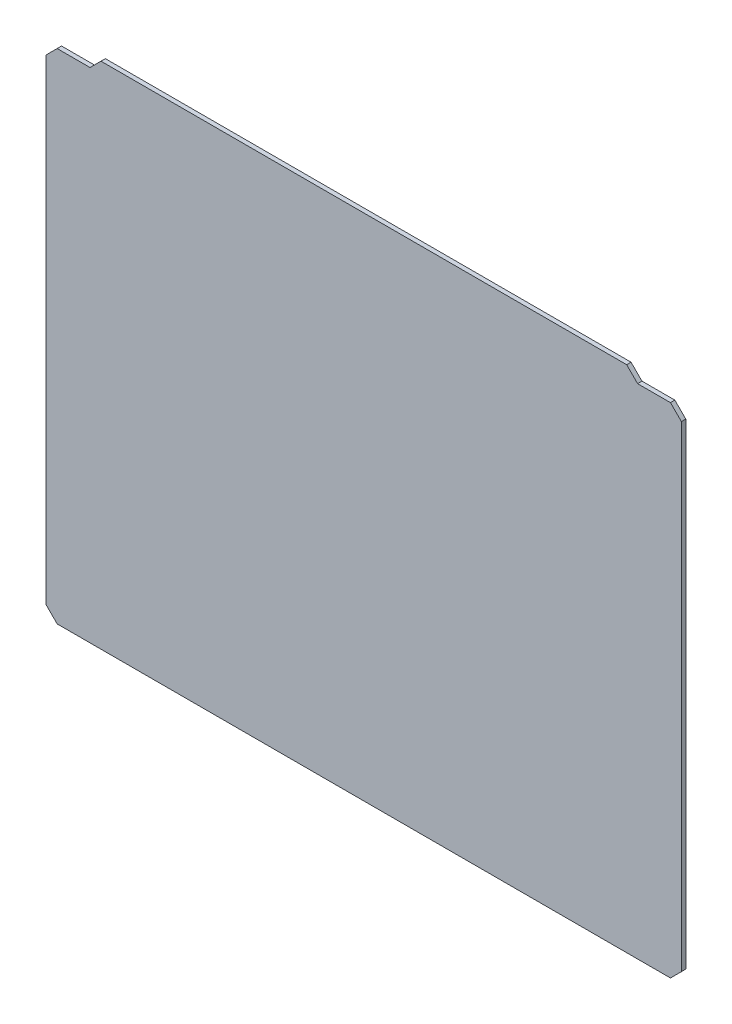
ISO-10303-21;
HEADER;
FILE_DESCRIPTION(('STEP AP214'),'2;1');
FILE_NAME('part.step','',(''),(''),'','','');
FILE_SCHEMA(('AUTOMOTIVE_DESIGN { 1 0 10303 214 1 1 1 1 }'));
ENDSEC;
DATA;
#1=APPLICATION_CONTEXT('core data for automotive mechanical design processes');
#2=APPLICATION_PROTOCOL_DEFINITION('international standard','automotive_design',2000,#1);
#3=PRODUCT_CONTEXT('',#1,'mechanical');
#4=PRODUCT('Part','Part','',(#3));
#5=PRODUCT_RELATED_PRODUCT_CATEGORY('part','',(#4));
#6=PRODUCT_DEFINITION_FORMATION('','',#4);
#7=PRODUCT_DEFINITION_CONTEXT('part definition',#1,'design');
#8=PRODUCT_DEFINITION('design','',#6,#7);
#9=PRODUCT_DEFINITION_SHAPE('','',#8);
#10=(LENGTH_UNIT() NAMED_UNIT(*) SI_UNIT(.MILLI.,.METRE.));
#11=(NAMED_UNIT(*) PLANE_ANGLE_UNIT() SI_UNIT($,.RADIAN.));
#12=(NAMED_UNIT(*) SI_UNIT($,.STERADIAN.) SOLID_ANGLE_UNIT());
#13=UNCERTAINTY_MEASURE_WITH_UNIT(LENGTH_MEASURE(1.E-05),#10,'distance_accuracy_value','');
#14=(GEOMETRIC_REPRESENTATION_CONTEXT(3) GLOBAL_UNCERTAINTY_ASSIGNED_CONTEXT((#13)) GLOBAL_UNIT_ASSIGNED_CONTEXT((#10,
#11,#12)) REPRESENTATION_CONTEXT('',''));
#15=CARTESIAN_POINT('',(0.,0.,0.));
#16=DIRECTION('',(0.,0.,1.));
#17=DIRECTION('',(1.,0.,0.));
#18=AXIS2_PLACEMENT_3D('',#15,#16,#17);
#19=CARTESIAN_POINT('',(-41.,-4.99999999999989,4.));
#20=DIRECTION('',(0.,-1.,0.));
#21=DIRECTION('',(1.,0.,0.));
#22=AXIS2_PLACEMENT_3D('',#19,#20,#21);
#23=PLANE('',#22);
#24=DIRECTION('',(-1.,0.,0.));
#25=VECTOR('',#24,1.);
#26=CARTESIAN_POINT('',(-41.,-4.99999999999989,0.));
#27=LINE('',#26,#25);
#28=CARTESIAN_POINT('',(-1.00000000000001,-4.99999999999989,0.));
#29=VERTEX_POINT('',#28);
#30=CARTESIAN_POINT('',(-30.9999999999999,-4.99999999999989,0.));
#31=VERTEX_POINT('',#30);
#32=EDGE_CURVE('E215',#29,#31,#27,.T.);
#33=ORIENTED_EDGE('',*,*,#32,.T.);
#34=DIRECTION('',(0.,0.,1.));
#35=VECTOR('',#34,1.);
#36=CARTESIAN_POINT('',(-30.9999999999999,-4.99999999999989,4.));
#37=LINE('',#36,#35);
#38=CARTESIAN_POINT('',(-30.9999999999999,-4.99999999999989,4.));
#39=VERTEX_POINT('',#38);
#40=EDGE_CURVE('E142',#31,#39,#37,.T.);
#41=ORIENTED_EDGE('',*,*,#40,.T.);
#42=DIRECTION('',(-1.,0.,0.));
#43=VECTOR('',#42,1.);
#44=CARTESIAN_POINT('',(-41.,-4.99999999999989,4.));
#45=LINE('',#44,#43);
#46=CARTESIAN_POINT('',(-1.00000000000001,-4.99999999999989,4.));
#47=VERTEX_POINT('',#46);
#48=EDGE_CURVE('E127',#47,#39,#45,.T.);
#49=ORIENTED_EDGE('',*,*,#48,.F.);
#50=DIRECTION('',(0.,0.,-1.));
#51=VECTOR('',#50,1.);
#52=CARTESIAN_POINT('',(-1.00000000000001,-4.99999999999989,4.));
#53=LINE('',#52,#51);
#54=EDGE_CURVE('E140',#47,#29,#53,.T.);
#55=ORIENTED_EDGE('',*,*,#54,.T.);
#56=EDGE_LOOP('',(#33,#41,#49,#55));
#57=FACE_BOUND('',#56,.T.);
#58=ADVANCED_FACE('F33',(#57),#23,.F.);
#59=CARTESIAN_POINT('',(-41.,-420.,4.));
#60=DIRECTION('',(1.,0.,0.));
#61=DIRECTION('',(0.,0.,-1.));
#62=AXIS2_PLACEMENT_3D('',#59,#60,#61);
#63=PLANE('',#62);
#64=DIRECTION('',(0.,-1.,0.));
#65=VECTOR('',#64,1.);
#66=CARTESIAN_POINT('',(-41.,-420.,4.));
#67=LINE('',#66,#65);
#68=CARTESIAN_POINT('',(-41.,-15.,4.));
#69=VERTEX_POINT('',#68);
#70=CARTESIAN_POINT('',(-41.,-450.,4.));
#71=VERTEX_POINT('',#70);
#72=EDGE_CURVE('E143',#69,#71,#67,.T.);
#73=ORIENTED_EDGE('',*,*,#72,.F.);
#74=DIRECTION('',(0.,0.,-1.));
#75=VECTOR('',#74,1.);
#76=CARTESIAN_POINT('',(-41.,-15.,4.));
#77=LINE('',#76,#75);
#78=CARTESIAN_POINT('',(-41.,-15.,0.));
#79=VERTEX_POINT('',#78);
#80=EDGE_CURVE('E166',#69,#79,#77,.T.);
#81=ORIENTED_EDGE('',*,*,#80,.T.);
#82=DIRECTION('',(0.,-1.,0.));
#83=VECTOR('',#82,1.);
#84=CARTESIAN_POINT('',(-41.,-420.,0.));
#85=LINE('',#84,#83);
#86=CARTESIAN_POINT('',(-41.,-450.,0.));
#87=VERTEX_POINT('',#86);
#88=EDGE_CURVE('E207',#79,#87,#85,.T.);
#89=ORIENTED_EDGE('',*,*,#88,.T.);
#90=DIRECTION('',(0.,0.,1.));
#91=VECTOR('',#90,1.);
#92=CARTESIAN_POINT('',(-41.,-450.,4.));
#93=LINE('',#92,#91);
#94=EDGE_CURVE('E164',#87,#71,#93,.T.);
#95=ORIENTED_EDGE('',*,*,#94,.T.);
#96=EDGE_LOOP('',(#73,#81,#89,#95));
#97=FACE_BOUND('',#96,.T.);
#98=ADVANCED_FACE('F238',(#97),#63,.F.);
#99=CARTESIAN_POINT('',(497.,-460.,4.));
#100=DIRECTION('',(0.,1.,0.));
#101=DIRECTION('',(0.,0.,1.));
#102=AXIS2_PLACEMENT_3D('',#99,#100,#101);
#103=PLANE('',#102);
#104=DIRECTION('',(1.,0.,0.));
#105=VECTOR('',#104,1.);
#106=CARTESIAN_POINT('',(-41.,-460.,4.));
#107=LINE('',#106,#105);
#108=CARTESIAN_POINT('',(-30.9999999999998,-460.,4.));
#109=VERTEX_POINT('',#108);
#110=CARTESIAN_POINT('',(529.,-460.,4.));
#111=VERTEX_POINT('',#110);
#112=EDGE_CURVE('E223',#109,#111,#107,.T.);
#113=ORIENTED_EDGE('',*,*,#112,.F.);
#114=DIRECTION('',(0.,0.,-1.));
#115=VECTOR('',#114,1.);
#116=CARTESIAN_POINT('',(-30.9999999999998,-460.,4.));
#117=LINE('',#116,#115);
#118=CARTESIAN_POINT('',(-30.9999999999998,-460.,0.));
#119=VERTEX_POINT('',#118);
#120=EDGE_CURVE('E187',#109,#119,#117,.T.);
#121=ORIENTED_EDGE('',*,*,#120,.T.);
#122=DIRECTION('',(1.,0.,0.));
#123=VECTOR('',#122,1.);
#124=CARTESIAN_POINT('',(497.,-460.,0.));
#125=LINE('',#124,#123);
#126=CARTESIAN_POINT('',(529.,-460.,0.));
#127=VERTEX_POINT('',#126);
#128=EDGE_CURVE('E204',#119,#127,#125,.T.);
#129=ORIENTED_EDGE('',*,*,#128,.T.);
#130=DIRECTION('',(0.,0.,1.));
#131=VECTOR('',#130,1.);
#132=CARTESIAN_POINT('',(529.,-460.,4.));
#133=LINE('',#132,#131);
#134=EDGE_CURVE('E185',#127,#111,#133,.T.);
#135=ORIENTED_EDGE('',*,*,#134,.T.);
#136=EDGE_LOOP('',(#113,#121,#129,#135));
#137=FACE_BOUND('',#136,.T.);
#138=ADVANCED_FACE('F236',(#137),#103,.F.);
#139=CARTESIAN_POINT('',(539.,-4.99999999999989,4.));
#140=DIRECTION('',(-1.,0.,0.));
#141=DIRECTION('',(0.,0.,1.));
#142=AXIS2_PLACEMENT_3D('',#139,#140,#141);
#143=PLANE('',#142);
#144=DIRECTION('',(0.,1.,0.));
#145=VECTOR('',#144,1.);
#146=CARTESIAN_POINT('',(539.,-460.,4.));
#147=LINE('',#146,#145);
#148=CARTESIAN_POINT('',(539.,-450.,4.));
#149=VERTEX_POINT('',#148);
#150=CARTESIAN_POINT('',(539.,-14.9999999999999,4.));
#151=VERTEX_POINT('',#150);
#152=EDGE_CURVE('E195',#149,#151,#147,.T.);
#153=ORIENTED_EDGE('',*,*,#152,.F.);
#154=DIRECTION('',(0.,0.,-1.));
#155=VECTOR('',#154,1.);
#156=CARTESIAN_POINT('',(539.,-450.,4.));
#157=LINE('',#156,#155);
#158=CARTESIAN_POINT('',(539.,-450.,0.));
#159=VERTEX_POINT('',#158);
#160=EDGE_CURVE('E41',#149,#159,#157,.T.);
#161=ORIENTED_EDGE('',*,*,#160,.T.);
#162=DIRECTION('',(0.,1.,0.));
#163=VECTOR('',#162,1.);
#164=CARTESIAN_POINT('',(539.,-4.99999999999989,0.));
#165=LINE('',#164,#163);
#166=CARTESIAN_POINT('',(539.,-14.9999999999999,0.));
#167=VERTEX_POINT('',#166);
#168=EDGE_CURVE('E194',#159,#167,#165,.T.);
#169=ORIENTED_EDGE('',*,*,#168,.T.);
#170=DIRECTION('',(0.,0.,1.));
#171=VECTOR('',#170,1.);
#172=CARTESIAN_POINT('',(539.,-14.9999999999999,4.));
#173=LINE('',#172,#171);
#174=EDGE_CURVE('E48',#167,#151,#173,.T.);
#175=ORIENTED_EDGE('',*,*,#174,.T.);
#176=EDGE_LOOP('',(#153,#161,#169,#175));
#177=FACE_BOUND('',#176,.T.);
#178=ADVANCED_FACE('F193',(#177),#143,.F.);
#179=CARTESIAN_POINT('',(499.,-4.99999999999989,4.));
#180=DIRECTION('',(0.,-1.,0.));
#181=DIRECTION('',(1.,0.,0.));
#182=AXIS2_PLACEMENT_3D('',#179,#180,#181);
#183=PLANE('',#182);
#184=DIRECTION('',(-1.,0.,0.));
#185=VECTOR('',#184,1.);
#186=CARTESIAN_POINT('',(499.,-4.99999999999989,4.));
#187=LINE('',#186,#185);
#188=CARTESIAN_POINT('',(529.,-4.99999999999989,4.));
#189=VERTEX_POINT('',#188);
#190=CARTESIAN_POINT('',(499.,-4.99999999999989,4.));
#191=VERTEX_POINT('',#190);
#192=EDGE_CURVE('E220',#189,#191,#187,.T.);
#193=ORIENTED_EDGE('',*,*,#192,.F.);
#194=DIRECTION('',(0.,0.,-1.));
#195=VECTOR('',#194,1.);
#196=CARTESIAN_POINT('',(529.,-4.99999999999989,4.));
#197=LINE('',#196,#195);
#198=CARTESIAN_POINT('',(529.,-4.99999999999989,0.));
#199=VERTEX_POINT('',#198);
#200=EDGE_CURVE('E11',#189,#199,#197,.T.);
#201=ORIENTED_EDGE('',*,*,#200,.T.);
#202=DIRECTION('',(-1.,0.,0.));
#203=VECTOR('',#202,1.);
#204=CARTESIAN_POINT('',(499.,-4.99999999999989,0.));
#205=LINE('',#204,#203);
#206=CARTESIAN_POINT('',(499.,-4.99999999999989,0.));
#207=VERTEX_POINT('',#206);
#208=EDGE_CURVE('E203',#199,#207,#205,.T.);
#209=ORIENTED_EDGE('',*,*,#208,.T.);
#210=DIRECTION('',(0.,0.,-1.));
#211=VECTOR('',#210,1.);
#212=CARTESIAN_POINT('',(499.,-4.99999999999989,4.));
#213=LINE('',#212,#211);
#214=EDGE_CURVE('E150',#191,#207,#213,.T.);
#215=ORIENTED_EDGE('',*,*,#214,.F.);
#216=EDGE_LOOP('',(#193,#201,#209,#215));
#217=FACE_BOUND('',#216,.T.);
#218=ADVANCED_FACE('F271',(#217),#183,.F.);
#219=CARTESIAN_POINT('',(-1.00000000000001,5.00000000000011,4.));
#220=DIRECTION('',(0.,-1.,0.));
#221=DIRECTION('',(0.,0.,-1.));
#222=AXIS2_PLACEMENT_3D('',#219,#220,#221);
#223=PLANE('',#222);
#224=DIRECTION('',(-1.,0.,0.));
#225=VECTOR('',#224,1.);
#226=CARTESIAN_POINT('',(-1.00000000000001,5.00000000000011,4.));
#227=LINE('',#226,#225);
#228=CARTESIAN_POINT('',(489.,5.00000000000011,4.));
#229=VERTEX_POINT('',#228);
#230=CARTESIAN_POINT('',(9.00000000000011,5.00000000000011,4.));
#231=VERTEX_POINT('',#230);
#232=EDGE_CURVE('E130',#229,#231,#227,.T.);
#233=ORIENTED_EDGE('',*,*,#232,.F.);
#234=DIRECTION('',(0.,0.,-1.));
#235=VECTOR('',#234,1.);
#236=CARTESIAN_POINT('',(489.,5.00000000000011,4.));
#237=LINE('',#236,#235);
#238=CARTESIAN_POINT('',(489.,5.00000000000011,0.));
#239=VERTEX_POINT('',#238);
#240=EDGE_CURVE('E152',#229,#239,#237,.T.);
#241=ORIENTED_EDGE('',*,*,#240,.T.);
#242=DIRECTION('',(-1.,0.,0.));
#243=VECTOR('',#242,1.);
#244=CARTESIAN_POINT('',(-1.00000000000001,5.00000000000011,0.));
#245=LINE('',#244,#243);
#246=CARTESIAN_POINT('',(9.00000000000011,5.00000000000011,0.));
#247=VERTEX_POINT('',#246);
#248=EDGE_CURVE('E144',#239,#247,#245,.T.);
#249=ORIENTED_EDGE('',*,*,#248,.T.);
#250=DIRECTION('',(0.,0.,1.));
#251=VECTOR('',#250,1.);
#252=CARTESIAN_POINT('',(9.00000000000011,5.00000000000011,4.));
#253=LINE('',#252,#251);
#254=EDGE_CURVE('E149',#247,#231,#253,.T.);
#255=ORIENTED_EDGE('',*,*,#254,.T.);
#256=EDGE_LOOP('',(#233,#241,#249,#255));
#257=FACE_BOUND('',#256,.T.);
#258=ADVANCED_FACE('F213',(#257),#223,.F.);
#259=CARTESIAN_POINT('',(0.,0.,4.));
#260=DIRECTION('',(0.,0.,1.));
#261=DIRECTION('',(1.,0.,0.));
#262=AXIS2_PLACEMENT_3D('',#259,#260,#261);
#263=PLANE('',#262);
#264=ORIENTED_EDGE('',*,*,#48,.T.);
#265=DIRECTION('',(0.707106781186548,0.707106781186548,0.));
#266=VECTOR('',#265,1.);
#267=CARTESIAN_POINT('',(-13.,13.,4.));
#268=LINE('',#267,#266);
#269=EDGE_CURVE('E183',#39,#69,#268,.F.);
#270=ORIENTED_EDGE('',*,*,#269,.T.);
#271=ORIENTED_EDGE('',*,*,#72,.T.);
#272=DIRECTION('',(-0.707106781186547,0.707106781186549,0.));
#273=VECTOR('',#272,1.);
#274=CARTESIAN_POINT('',(-245.5,-245.499999999999,4.));
#275=LINE('',#274,#273);
#276=EDGE_CURVE('E181',#71,#109,#275,.F.);
#277=ORIENTED_EDGE('',*,*,#276,.T.);
#278=ORIENTED_EDGE('',*,*,#112,.T.);
#279=DIRECTION('',(-0.707106781186548,-0.707106781186548,0.));
#280=VECTOR('',#279,1.);
#281=CARTESIAN_POINT('',(494.5,-494.5,4.));
#282=LINE('',#281,#280);
#283=EDGE_CURVE('E55',#111,#149,#282,.F.);
#284=ORIENTED_EDGE('',*,*,#283,.T.);
#285=ORIENTED_EDGE('',*,*,#152,.T.);
#286=DIRECTION('',(0.707106781186544,-0.707106781186551,0.));
#287=VECTOR('',#286,1.);
#288=CARTESIAN_POINT('',(262.000000000003,262.,4.));
#289=LINE('',#288,#287);
#290=EDGE_CURVE('E178',#151,#189,#289,.F.);
#291=ORIENTED_EDGE('',*,*,#290,.T.);
#292=ORIENTED_EDGE('',*,*,#192,.T.);
#293=DIRECTION('',(0.707106781186544,-0.707106781186551,0.));
#294=VECTOR('',#293,1.);
#295=CARTESIAN_POINT('',(247.000000000003,247.,4.));
#296=LINE('',#295,#294);
#297=EDGE_CURVE('E134',#191,#229,#296,.F.);
#298=ORIENTED_EDGE('',*,*,#297,.T.);
#299=ORIENTED_EDGE('',*,*,#232,.T.);
#300=DIRECTION('',(0.707106781186548,0.707106781186548,0.));
#301=VECTOR('',#300,1.);
#302=CARTESIAN_POINT('',(2.,-2.,4.));
#303=LINE('',#302,#301);
#304=EDGE_CURVE('E124',#231,#47,#303,.F.);
#305=ORIENTED_EDGE('',*,*,#304,.T.);
#306=EDGE_LOOP('',(#264,#270,#271,#277,#278,#284,#285,#291,#292,#298,#299,#305));
#307=FACE_BOUND('',#306,.T.);
#308=ADVANCED_FACE('F126',(#307),#263,.T.);
#309=CARTESIAN_POINT('',(0.,0.,0.));
#310=DIRECTION('',(0.,0.,1.));
#311=DIRECTION('',(1.,0.,0.));
#312=AXIS2_PLACEMENT_3D('',#309,#310,#311);
#313=PLANE('',#312);
#314=ORIENTED_EDGE('',*,*,#88,.F.);
#315=DIRECTION('',(-0.707106781186548,-0.707106781186548,0.));
#316=VECTOR('',#315,1.);
#317=CARTESIAN_POINT('',(-41.,-15.,0.));
#318=LINE('',#317,#316);
#319=EDGE_CURVE('E175',#79,#31,#318,.F.);
#320=ORIENTED_EDGE('',*,*,#319,.T.);
#321=ORIENTED_EDGE('',*,*,#32,.F.);
#322=DIRECTION('',(-0.707106781186548,-0.707106781186548,0.));
#323=VECTOR('',#322,1.);
#324=CARTESIAN_POINT('',(-1.00000000000001,-5.00000000000001,0.));
#325=LINE('',#324,#323);
#326=EDGE_CURVE('E147',#29,#247,#325,.F.);
#327=ORIENTED_EDGE('',*,*,#326,.T.);
#328=ORIENTED_EDGE('',*,*,#248,.F.);
#329=DIRECTION('',(-0.707106781186544,0.707106781186551,0.));
#330=VECTOR('',#329,1.);
#331=CARTESIAN_POINT('',(489.,5.00000000000011,0.));
#332=LINE('',#331,#330);
#333=EDGE_CURVE('E135',#239,#207,#332,.F.);
#334=ORIENTED_EDGE('',*,*,#333,.T.);
#335=ORIENTED_EDGE('',*,*,#208,.F.);
#336=DIRECTION('',(-0.707106781186544,0.707106781186551,0.));
#337=VECTOR('',#336,1.);
#338=CARTESIAN_POINT('',(529.,-4.99999999999989,0.));
#339=LINE('',#338,#337);
#340=EDGE_CURVE('E169',#199,#167,#339,.F.);
#341=ORIENTED_EDGE('',*,*,#340,.T.);
#342=ORIENTED_EDGE('',*,*,#168,.F.);
#343=DIRECTION('',(0.707106781186548,0.707106781186548,0.));
#344=VECTOR('',#343,1.);
#345=CARTESIAN_POINT('',(539.,-450.,0.));
#346=LINE('',#345,#344);
#347=EDGE_CURVE('E171',#159,#127,#346,.F.);
#348=ORIENTED_EDGE('',*,*,#347,.T.);
#349=ORIENTED_EDGE('',*,*,#128,.F.);
#350=DIRECTION('',(0.707106781186547,-0.707106781186549,0.));
#351=VECTOR('',#350,1.);
#352=CARTESIAN_POINT('',(-30.9999999999998,-460.,0.));
#353=LINE('',#352,#351);
#354=EDGE_CURVE('E173',#119,#87,#353,.F.);
#355=ORIENTED_EDGE('',*,*,#354,.T.);
#356=EDGE_LOOP('',(#314,#320,#321,#327,#328,#334,#335,#341,#342,#348,#349,#355));
#357=FACE_BOUND('',#356,.T.);
#358=ADVANCED_FACE('F199',(#357),#313,.F.);
#359=CARTESIAN_POINT('',(489.,5.00000000000011,4.));
#360=DIRECTION('',(-0.707106781186551,-0.707106781186544,0.));
#361=DIRECTION('',(0.,0.,-1.));
#362=AXIS2_PLACEMENT_3D('',#359,#360,#361);
#363=PLANE('',#362);
#364=ORIENTED_EDGE('',*,*,#297,.F.);
#365=ORIENTED_EDGE('',*,*,#214,.T.);
#366=ORIENTED_EDGE('',*,*,#333,.F.);
#367=ORIENTED_EDGE('',*,*,#240,.F.);
#368=EDGE_LOOP('',(#364,#365,#366,#367));
#369=FACE_BOUND('',#368,.T.);
#370=ADVANCED_FACE('F249',(#369),#363,.F.);
#371=CARTESIAN_POINT('',(-1.00000000000001,-5.00000000000001,4.));
#372=DIRECTION('',(0.707106781186547,-0.707106781186547,0.));
#373=DIRECTION('',(0.,0.,-1.));
#374=AXIS2_PLACEMENT_3D('',#371,#372,#373);
#375=PLANE('',#374);
#376=ORIENTED_EDGE('',*,*,#304,.F.);
#377=ORIENTED_EDGE('',*,*,#254,.F.);
#378=ORIENTED_EDGE('',*,*,#326,.F.);
#379=ORIENTED_EDGE('',*,*,#54,.F.);
#380=EDGE_LOOP('',(#376,#377,#378,#379));
#381=FACE_BOUND('',#380,.T.);
#382=ADVANCED_FACE('F146',(#381),#375,.F.);
#383=CARTESIAN_POINT('',(-41.,-15.,4.));
#384=DIRECTION('',(0.707106781186547,-0.707106781186547,0.));
#385=DIRECTION('',(0.,0.,-1.));
#386=AXIS2_PLACEMENT_3D('',#383,#384,#385);
#387=PLANE('',#386);
#388=ORIENTED_EDGE('',*,*,#269,.F.);
#389=ORIENTED_EDGE('',*,*,#40,.F.);
#390=ORIENTED_EDGE('',*,*,#319,.F.);
#391=ORIENTED_EDGE('',*,*,#80,.F.);
#392=EDGE_LOOP('',(#388,#389,#390,#391));
#393=FACE_BOUND('',#392,.T.);
#394=ADVANCED_FACE('F240',(#393),#387,.F.);
#395=CARTESIAN_POINT('',(-30.9999999999998,-460.,4.));
#396=DIRECTION('',(0.707106781186549,0.707106781186547,0.));
#397=DIRECTION('',(0.,0.,-1.));
#398=AXIS2_PLACEMENT_3D('',#395,#396,#397);
#399=PLANE('',#398);
#400=ORIENTED_EDGE('',*,*,#276,.F.);
#401=ORIENTED_EDGE('',*,*,#94,.F.);
#402=ORIENTED_EDGE('',*,*,#354,.F.);
#403=ORIENTED_EDGE('',*,*,#120,.F.);
#404=EDGE_LOOP('',(#400,#401,#402,#403));
#405=FACE_BOUND('',#404,.T.);
#406=ADVANCED_FACE('F234',(#405),#399,.F.);
#407=CARTESIAN_POINT('',(539.,-450.,4.));
#408=DIRECTION('',(-0.707106781186547,0.707106781186547,0.));
#409=DIRECTION('',(0.,0.,-1.));
#410=AXIS2_PLACEMENT_3D('',#407,#408,#409);
#411=PLANE('',#410);
#412=ORIENTED_EDGE('',*,*,#283,.F.);
#413=ORIENTED_EDGE('',*,*,#134,.F.);
#414=ORIENTED_EDGE('',*,*,#347,.F.);
#415=ORIENTED_EDGE('',*,*,#160,.F.);
#416=EDGE_LOOP('',(#412,#413,#414,#415));
#417=FACE_BOUND('',#416,.T.);
#418=ADVANCED_FACE('F247',(#417),#411,.F.);
#419=CARTESIAN_POINT('',(529.,-4.99999999999989,4.));
#420=DIRECTION('',(-0.707106781186551,-0.707106781186544,0.));
#421=DIRECTION('',(0.,0.,-1.));
#422=AXIS2_PLACEMENT_3D('',#419,#420,#421);
#423=PLANE('',#422);
#424=ORIENTED_EDGE('',*,*,#290,.F.);
#425=ORIENTED_EDGE('',*,*,#174,.F.);
#426=ORIENTED_EDGE('',*,*,#340,.F.);
#427=ORIENTED_EDGE('',*,*,#200,.F.);
#428=EDGE_LOOP('',(#424,#425,#426,#427));
#429=FACE_BOUND('',#428,.T.);
#430=ADVANCED_FACE('F35',(#429),#423,.F.);
#431=CLOSED_SHELL('',(#58,#98,#138,#178,#218,#258,#308,#358,#370,#382,#394,#406,#418,#430));
#432=MANIFOLD_SOLID_BREP('B2',#431);
#433=ADVANCED_BREP_SHAPE_REPRESENTATION('',(#18,#432),#14);
#434=SHAPE_DEFINITION_REPRESENTATION(#9,#433);
ENDSEC;
END-ISO-10303-21;
